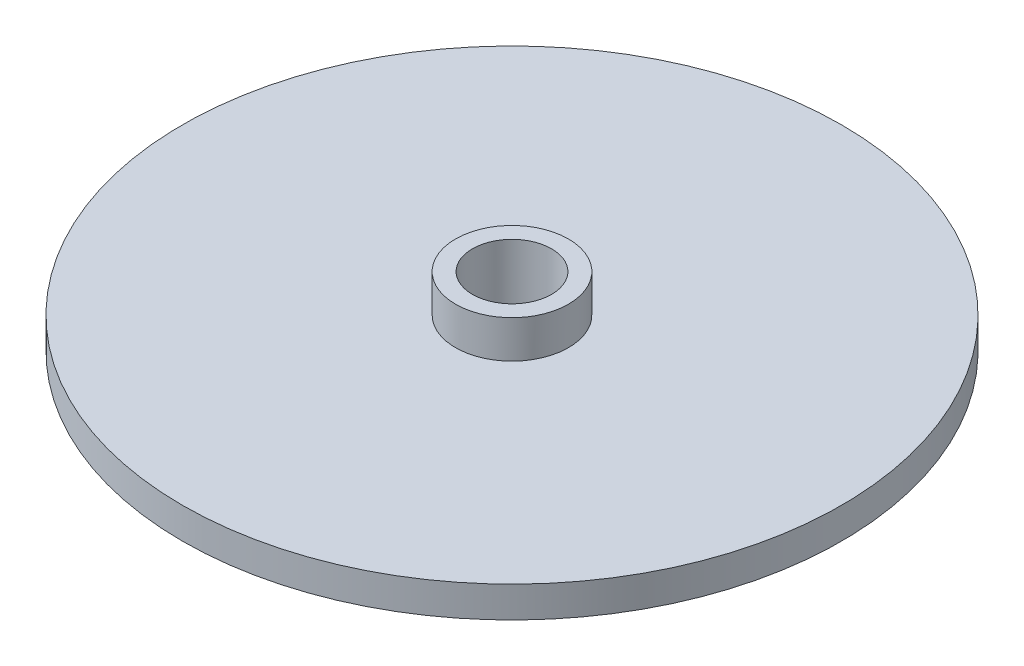
ISO-10303-21;
HEADER;
FILE_DESCRIPTION(('STEP AP214'),'2;1');
FILE_NAME('part.step','',(''),(''),'','','');
FILE_SCHEMA(('AUTOMOTIVE_DESIGN { 1 0 10303 214 1 1 1 1 }'));
ENDSEC;
DATA;
#1=APPLICATION_CONTEXT('core data for automotive mechanical design processes');
#2=APPLICATION_PROTOCOL_DEFINITION('international standard','automotive_design',2000,#1);
#3=PRODUCT_CONTEXT('',#1,'mechanical');
#4=PRODUCT('Part','Part','',(#3));
#5=PRODUCT_RELATED_PRODUCT_CATEGORY('part','',(#4));
#6=PRODUCT_DEFINITION_FORMATION('','',#4);
#7=PRODUCT_DEFINITION_CONTEXT('part definition',#1,'design');
#8=PRODUCT_DEFINITION('design','',#6,#7);
#9=PRODUCT_DEFINITION_SHAPE('','',#8);
#10=(LENGTH_UNIT() NAMED_UNIT(*) SI_UNIT(.MILLI.,.METRE.));
#11=(NAMED_UNIT(*) PLANE_ANGLE_UNIT() SI_UNIT($,.RADIAN.));
#12=(NAMED_UNIT(*) SI_UNIT($,.STERADIAN.) SOLID_ANGLE_UNIT());
#13=UNCERTAINTY_MEASURE_WITH_UNIT(LENGTH_MEASURE(1.E-05),#10,'distance_accuracy_value','');
#14=(GEOMETRIC_REPRESENTATION_CONTEXT(3) GLOBAL_UNCERTAINTY_ASSIGNED_CONTEXT((#13)) GLOBAL_UNIT_ASSIGNED_CONTEXT((#10,
#11,#12)) REPRESENTATION_CONTEXT('',''));
#15=CARTESIAN_POINT('',(0.,0.,0.));
#16=DIRECTION('',(0.,0.,1.));
#17=DIRECTION('',(1.,0.,0.));
#18=AXIS2_PLACEMENT_3D('',#15,#16,#17);
#19=CARTESIAN_POINT('',(0.,3.,0.));
#20=DIRECTION('',(0.,-1.,0.));
#21=DIRECTION('',(0.,0.,-1.));
#22=AXIS2_PLACEMENT_3D('',#19,#20,#21);
#23=CYLINDRICAL_SURFACE('',#22,3.);
#24=CARTESIAN_POINT('',(0.,3.,0.));
#25=DIRECTION('',(0.,1.,0.));
#26=DIRECTION('',(0.,0.,1.));
#27=AXIS2_PLACEMENT_3D('',#24,#25,#26);
#28=CIRCLE('',#27,3.);
#29=CARTESIAN_POINT('',(0.,3.,3.));
#30=VERTEX_POINT('',#29);
#31=EDGE_CURVE('E36',#30,#30,#28,.T.);
#32=ORIENTED_EDGE('',*,*,#31,.F.);
#33=EDGE_LOOP('',(#32));
#34=FACE_BOUND('',#33,.T.);
#35=CARTESIAN_POINT('',(0.,1.,0.));
#36=DIRECTION('',(0.,-1.,0.));
#37=DIRECTION('',(0.,0.,-1.));
#38=AXIS2_PLACEMENT_3D('',#35,#36,#37);
#39=CIRCLE('',#38,3.);
#40=CARTESIAN_POINT('',(0.,1.,-3.));
#41=VERTEX_POINT('',#40);
#42=EDGE_CURVE('E10',#41,#41,#39,.T.);
#43=ORIENTED_EDGE('',*,*,#42,.F.);
#44=EDGE_LOOP('',(#43));
#45=FACE_BOUND('',#44,.T.);
#46=ADVANCED_FACE('F33',(#34,#45),#23,.T.);
#47=CARTESIAN_POINT('',(0.,3.,0.));
#48=DIRECTION('',(0.,1.,0.));
#49=DIRECTION('',(0.,0.,1.));
#50=AXIS2_PLACEMENT_3D('',#47,#48,#49);
#51=PLANE('',#50);
#52=ORIENTED_EDGE('',*,*,#31,.T.);
#53=EDGE_LOOP('',(#52));
#54=FACE_BOUND('',#53,.T.);
#55=CARTESIAN_POINT('',(0.,3.,0.));
#56=DIRECTION('',(0.,1.,0.));
#57=DIRECTION('',(0.,0.,1.));
#58=AXIS2_PLACEMENT_3D('',#55,#56,#57);
#59=CIRCLE('',#58,2.1);
#60=CARTESIAN_POINT('',(0.,3.,2.1));
#61=VERTEX_POINT('',#60);
#62=EDGE_CURVE('E44',#61,#61,#59,.T.);
#63=ORIENTED_EDGE('',*,*,#62,.F.);
#64=EDGE_LOOP('',(#63));
#65=FACE_BOUND('',#64,.T.);
#66=ADVANCED_FACE('F76',(#54,#65),#51,.T.);
#67=CARTESIAN_POINT('',(0.,3.,0.));
#68=DIRECTION('',(0.,-1.,0.));
#69=DIRECTION('',(0.,0.,-1.));
#70=AXIS2_PLACEMENT_3D('',#67,#68,#69);
#71=CYLINDRICAL_SURFACE('',#70,2.1);
#72=ORIENTED_EDGE('',*,*,#62,.T.);
#73=EDGE_LOOP('',(#72));
#74=FACE_BOUND('',#73,.T.);
#75=CARTESIAN_POINT('',(0.,-0.65,0.));
#76=DIRECTION('',(0.,-1.,0.));
#77=DIRECTION('',(0.,0.,-1.));
#78=AXIS2_PLACEMENT_3D('',#75,#76,#77);
#79=CIRCLE('',#78,2.1);
#80=CARTESIAN_POINT('',(0.,-0.65,-2.1));
#81=VERTEX_POINT('',#80);
#82=EDGE_CURVE('E56',#81,#81,#79,.T.);
#83=ORIENTED_EDGE('',*,*,#82,.T.);
#84=EDGE_LOOP('',(#83));
#85=FACE_BOUND('',#84,.T.);
#86=ADVANCED_FACE('F63',(#74,#85),#71,.F.);
#87=CARTESIAN_POINT('',(0.,1.,0.));
#88=DIRECTION('',(0.,-1.,0.));
#89=DIRECTION('',(0.,0.,-1.));
#90=AXIS2_PLACEMENT_3D('',#87,#88,#89);
#91=PLANE('',#90);
#92=CARTESIAN_POINT('',(0.,1.,0.));
#93=DIRECTION('',(0.,-1.,0.));
#94=DIRECTION('',(0.,0.,-1.));
#95=AXIS2_PLACEMENT_3D('',#92,#93,#94);
#96=CIRCLE('',#95,17.5);
#97=CARTESIAN_POINT('',(0.,1.,-17.5));
#98=VERTEX_POINT('',#97);
#99=EDGE_CURVE('E46',#98,#98,#96,.T.);
#100=ORIENTED_EDGE('',*,*,#99,.F.);
#101=EDGE_LOOP('',(#100));
#102=FACE_BOUND('',#101,.T.);
#103=ORIENTED_EDGE('',*,*,#42,.T.);
#104=EDGE_LOOP('',(#103));
#105=FACE_BOUND('',#104,.T.);
#106=ADVANCED_FACE('F72',(#102,#105),#91,.F.);
#107=CARTESIAN_POINT('',(0.,1.,0.));
#108=DIRECTION('',(0.,-1.,0.));
#109=DIRECTION('',(0.,0.,-1.));
#110=AXIS2_PLACEMENT_3D('',#107,#108,#109);
#111=CYLINDRICAL_SURFACE('',#110,17.5);
#112=ORIENTED_EDGE('',*,*,#99,.T.);
#113=EDGE_LOOP('',(#112));
#114=FACE_BOUND('',#113,.T.);
#115=CARTESIAN_POINT('',(0.,-0.65,0.));
#116=DIRECTION('',(0.,-1.,0.));
#117=DIRECTION('',(0.,0.,-1.));
#118=AXIS2_PLACEMENT_3D('',#115,#116,#117);
#119=CIRCLE('',#118,17.5);
#120=CARTESIAN_POINT('',(0.,-0.65,-17.5));
#121=VERTEX_POINT('',#120);
#122=EDGE_CURVE('E52',#121,#121,#119,.T.);
#123=ORIENTED_EDGE('',*,*,#122,.F.);
#124=EDGE_LOOP('',(#123));
#125=FACE_BOUND('',#124,.T.);
#126=ADVANCED_FACE('F67',(#114,#125),#111,.T.);
#127=CARTESIAN_POINT('',(0.,-0.65,0.));
#128=DIRECTION('',(0.,-1.,0.));
#129=DIRECTION('',(0.,0.,-1.));
#130=AXIS2_PLACEMENT_3D('',#127,#128,#129);
#131=PLANE('',#130);
#132=ORIENTED_EDGE('',*,*,#122,.T.);
#133=EDGE_LOOP('',(#132));
#134=FACE_BOUND('',#133,.T.);
#135=ORIENTED_EDGE('',*,*,#82,.F.);
#136=EDGE_LOOP('',(#135));
#137=FACE_BOUND('',#136,.T.);
#138=ADVANCED_FACE('F65',(#134,#137),#131,.T.);
#139=CLOSED_SHELL('',(#46,#66,#86,#106,#126,#138));
#140=MANIFOLD_SOLID_BREP('B2',#139);
#141=ADVANCED_BREP_SHAPE_REPRESENTATION('',(#18,#140),#14);
#142=SHAPE_DEFINITION_REPRESENTATION(#9,#141);
ENDSEC;
END-ISO-10303-21;
